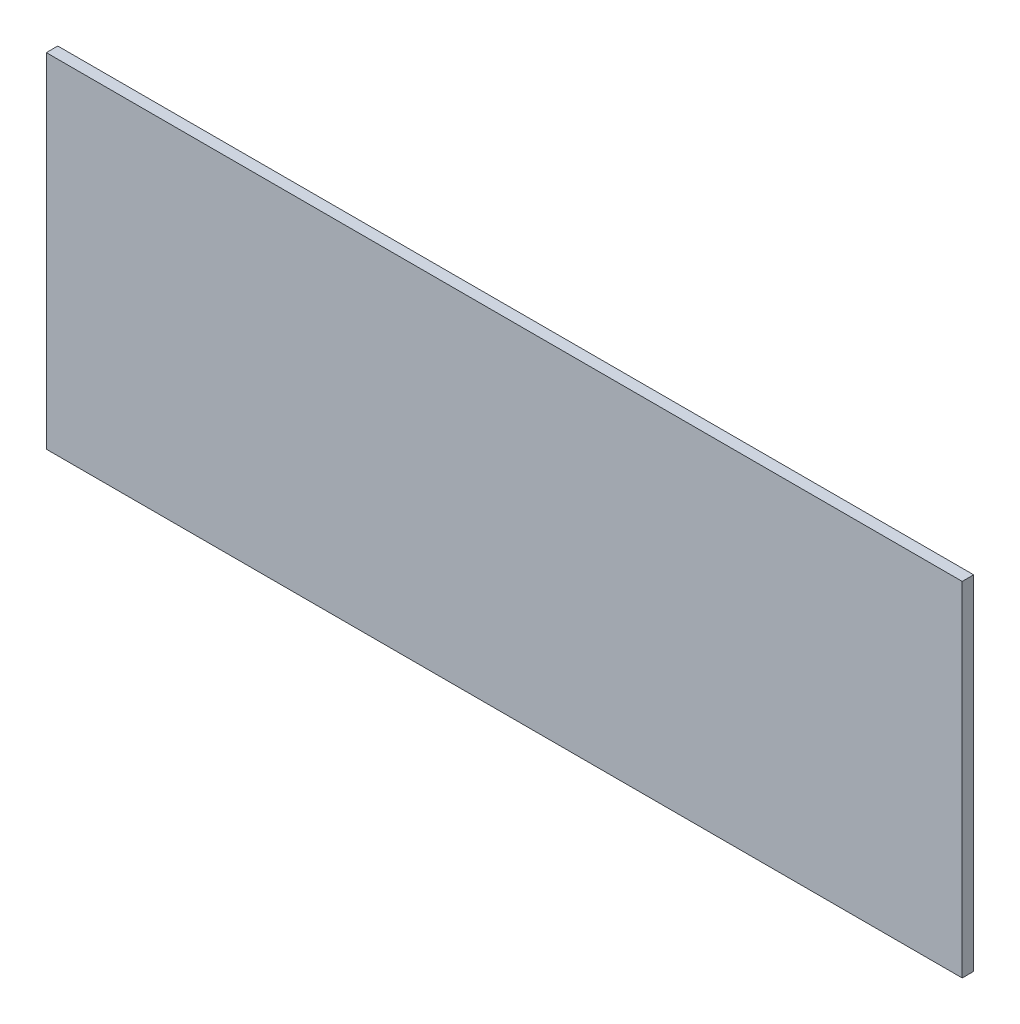
ISO-10303-21;
HEADER;
FILE_DESCRIPTION(('STEP AP214'),'2;1');
FILE_NAME('part.step','',(''),(''),'','','');
FILE_SCHEMA(('AUTOMOTIVE_DESIGN { 1 0 10303 214 1 1 1 1 }'));
ENDSEC;
DATA;
#1=APPLICATION_CONTEXT('core data for automotive mechanical design processes');
#2=APPLICATION_PROTOCOL_DEFINITION('international standard','automotive_design',2000,#1);
#3=PRODUCT_CONTEXT('',#1,'mechanical');
#4=PRODUCT('Part','Part','',(#3));
#5=PRODUCT_RELATED_PRODUCT_CATEGORY('part','',(#4));
#6=PRODUCT_DEFINITION_FORMATION('','',#4);
#7=PRODUCT_DEFINITION_CONTEXT('part definition',#1,'design');
#8=PRODUCT_DEFINITION('design','',#6,#7);
#9=PRODUCT_DEFINITION_SHAPE('','',#8);
#10=(LENGTH_UNIT() NAMED_UNIT(*) SI_UNIT(.MILLI.,.METRE.));
#11=(NAMED_UNIT(*) PLANE_ANGLE_UNIT() SI_UNIT($,.RADIAN.));
#12=(NAMED_UNIT(*) SI_UNIT($,.STERADIAN.) SOLID_ANGLE_UNIT());
#13=UNCERTAINTY_MEASURE_WITH_UNIT(LENGTH_MEASURE(1.E-05),#10,'distance_accuracy_value','');
#14=(GEOMETRIC_REPRESENTATION_CONTEXT(3) GLOBAL_UNCERTAINTY_ASSIGNED_CONTEXT((#13)) GLOBAL_UNIT_ASSIGNED_CONTEXT((#10,
#11,#12)) REPRESENTATION_CONTEXT('',''));
#15=CARTESIAN_POINT('',(0.,0.,0.));
#16=DIRECTION('',(0.,0.,1.));
#17=DIRECTION('',(1.,0.,0.));
#18=AXIS2_PLACEMENT_3D('',#15,#16,#17);
#19=CARTESIAN_POINT('',(40.,-15.,1.));
#20=DIRECTION('',(-1.,0.,0.));
#21=DIRECTION('',(0.,0.,1.));
#22=AXIS2_PLACEMENT_3D('',#19,#20,#21);
#23=PLANE('',#22);
#24=DIRECTION('',(0.,1.,0.));
#25=VECTOR('',#24,1.);
#26=CARTESIAN_POINT('',(40.,-15.,0.));
#27=LINE('',#26,#25);
#28=CARTESIAN_POINT('',(40.,-15.,0.));
#29=VERTEX_POINT('',#28);
#30=CARTESIAN_POINT('',(40.,15.,0.));
#31=VERTEX_POINT('',#30);
#32=EDGE_CURVE('E96',#29,#31,#27,.T.);
#33=ORIENTED_EDGE('',*,*,#32,.T.);
#34=DIRECTION('',(0.,0.,-1.));
#35=VECTOR('',#34,1.);
#36=CARTESIAN_POINT('',(40.,15.,1.));
#37=LINE('',#36,#35);
#38=CARTESIAN_POINT('',(40.,15.,1.));
#39=VERTEX_POINT('',#38);
#40=EDGE_CURVE('E11',#39,#31,#37,.T.);
#41=ORIENTED_EDGE('',*,*,#40,.F.);
#42=DIRECTION('',(0.,1.,0.));
#43=VECTOR('',#42,1.);
#44=CARTESIAN_POINT('',(40.,-15.,1.));
#45=LINE('',#44,#43);
#46=CARTESIAN_POINT('',(40.,-15.,1.));
#47=VERTEX_POINT('',#46);
#48=EDGE_CURVE('E84',#47,#39,#45,.T.);
#49=ORIENTED_EDGE('',*,*,#48,.F.);
#50=DIRECTION('',(0.,0.,-1.));
#51=VECTOR('',#50,1.);
#52=CARTESIAN_POINT('',(40.,-15.,1.));
#53=LINE('',#52,#51);
#54=EDGE_CURVE('E92',#47,#29,#53,.T.);
#55=ORIENTED_EDGE('',*,*,#54,.T.);
#56=EDGE_LOOP('',(#33,#41,#49,#55));
#57=FACE_BOUND('',#56,.T.);
#58=ADVANCED_FACE('F33',(#57),#23,.F.);
#59=CARTESIAN_POINT('',(-40.,15.,1.));
#60=DIRECTION('',(0.,-1.,0.));
#61=DIRECTION('',(0.,0.,-1.));
#62=AXIS2_PLACEMENT_3D('',#59,#60,#61);
#63=PLANE('',#62);
#64=DIRECTION('',(-1.,0.,0.));
#65=VECTOR('',#64,1.);
#66=CARTESIAN_POINT('',(-40.,15.,0.));
#67=LINE('',#66,#65);
#68=CARTESIAN_POINT('',(-40.,15.,0.));
#69=VERTEX_POINT('',#68);
#70=EDGE_CURVE('E88',#31,#69,#67,.T.);
#71=ORIENTED_EDGE('',*,*,#70,.T.);
#72=DIRECTION('',(0.,0.,-1.));
#73=VECTOR('',#72,1.);
#74=CARTESIAN_POINT('',(-40.,15.,1.));
#75=LINE('',#74,#73);
#76=CARTESIAN_POINT('',(-40.,15.,1.));
#77=VERTEX_POINT('',#76);
#78=EDGE_CURVE('E41',#77,#69,#75,.T.);
#79=ORIENTED_EDGE('',*,*,#78,.F.);
#80=DIRECTION('',(-1.,0.,0.));
#81=VECTOR('',#80,1.);
#82=CARTESIAN_POINT('',(-40.,15.,1.));
#83=LINE('',#82,#81);
#84=EDGE_CURVE('E79',#39,#77,#83,.T.);
#85=ORIENTED_EDGE('',*,*,#84,.F.);
#86=ORIENTED_EDGE('',*,*,#40,.T.);
#87=EDGE_LOOP('',(#71,#79,#85,#86));
#88=FACE_BOUND('',#87,.T.);
#89=ADVANCED_FACE('F87',(#88),#63,.F.);
#90=CARTESIAN_POINT('',(-40.,-15.,1.));
#91=DIRECTION('',(1.,0.,0.));
#92=DIRECTION('',(0.,0.,-1.));
#93=AXIS2_PLACEMENT_3D('',#90,#91,#92);
#94=PLANE('',#93);
#95=DIRECTION('',(0.,-1.,0.));
#96=VECTOR('',#95,1.);
#97=CARTESIAN_POINT('',(-40.,-15.,0.));
#98=LINE('',#97,#96);
#99=CARTESIAN_POINT('',(-40.,-15.,0.));
#100=VERTEX_POINT('',#99);
#101=EDGE_CURVE('E66',#69,#100,#98,.T.);
#102=ORIENTED_EDGE('',*,*,#101,.T.);
#103=DIRECTION('',(0.,0.,-1.));
#104=VECTOR('',#103,1.);
#105=CARTESIAN_POINT('',(-40.,-15.,1.));
#106=LINE('',#105,#104);
#107=CARTESIAN_POINT('',(-40.,-15.,1.));
#108=VERTEX_POINT('',#107);
#109=EDGE_CURVE('E89',#108,#100,#106,.T.);
#110=ORIENTED_EDGE('',*,*,#109,.F.);
#111=DIRECTION('',(0.,-1.,0.));
#112=VECTOR('',#111,1.);
#113=CARTESIAN_POINT('',(-40.,-15.,1.));
#114=LINE('',#113,#112);
#115=EDGE_CURVE('E82',#77,#108,#114,.T.);
#116=ORIENTED_EDGE('',*,*,#115,.F.);
#117=ORIENTED_EDGE('',*,*,#78,.T.);
#118=EDGE_LOOP('',(#102,#110,#116,#117));
#119=FACE_BOUND('',#118,.T.);
#120=ADVANCED_FACE('F90',(#119),#94,.F.);
#121=CARTESIAN_POINT('',(-40.,-15.,1.));
#122=DIRECTION('',(0.,1.,0.));
#123=DIRECTION('',(0.,0.,1.));
#124=AXIS2_PLACEMENT_3D('',#121,#122,#123);
#125=PLANE('',#124);
#126=DIRECTION('',(1.,0.,0.));
#127=VECTOR('',#126,1.);
#128=CARTESIAN_POINT('',(-40.,-15.,0.));
#129=LINE('',#128,#127);
#130=EDGE_CURVE('E72',#100,#29,#129,.T.);
#131=ORIENTED_EDGE('',*,*,#130,.T.);
#132=ORIENTED_EDGE('',*,*,#54,.F.);
#133=DIRECTION('',(1.,0.,0.));
#134=VECTOR('',#133,1.);
#135=CARTESIAN_POINT('',(-40.,-15.,1.));
#136=LINE('',#135,#134);
#137=EDGE_CURVE('E49',#108,#47,#136,.T.);
#138=ORIENTED_EDGE('',*,*,#137,.F.);
#139=ORIENTED_EDGE('',*,*,#109,.T.);
#140=EDGE_LOOP('',(#131,#132,#138,#139));
#141=FACE_BOUND('',#140,.T.);
#142=ADVANCED_FACE('F103',(#141),#125,.F.);
#143=CARTESIAN_POINT('',(0.,0.,1.));
#144=DIRECTION('',(0.,0.,-1.));
#145=DIRECTION('',(-1.,0.,0.));
#146=AXIS2_PLACEMENT_3D('',#143,#144,#145);
#147=PLANE('',#146);
#148=ORIENTED_EDGE('',*,*,#48,.T.);
#149=ORIENTED_EDGE('',*,*,#84,.T.);
#150=ORIENTED_EDGE('',*,*,#115,.T.);
#151=ORIENTED_EDGE('',*,*,#137,.T.);
#152=EDGE_LOOP('',(#148,#149,#150,#151));
#153=FACE_BOUND('',#152,.T.);
#154=ADVANCED_FACE('F80',(#153),#147,.F.);
#155=CARTESIAN_POINT('',(0.,0.,0.));
#156=DIRECTION('',(0.,0.,-1.));
#157=DIRECTION('',(-1.,0.,0.));
#158=AXIS2_PLACEMENT_3D('',#155,#156,#157);
#159=PLANE('',#158);
#160=ORIENTED_EDGE('',*,*,#32,.F.);
#161=ORIENTED_EDGE('',*,*,#130,.F.);
#162=ORIENTED_EDGE('',*,*,#101,.F.);
#163=ORIENTED_EDGE('',*,*,#70,.F.);
#164=EDGE_LOOP('',(#160,#161,#162,#163));
#165=FACE_BOUND('',#164,.T.);
#166=ADVANCED_FACE('F106',(#165),#159,.T.);
#167=CLOSED_SHELL('',(#58,#89,#120,#142,#154,#166));
#168=MANIFOLD_SOLID_BREP('B2',#167);
#169=ADVANCED_BREP_SHAPE_REPRESENTATION('',(#18,#168),#14);
#170=SHAPE_DEFINITION_REPRESENTATION(#9,#169);
ENDSEC;
END-ISO-10303-21;
